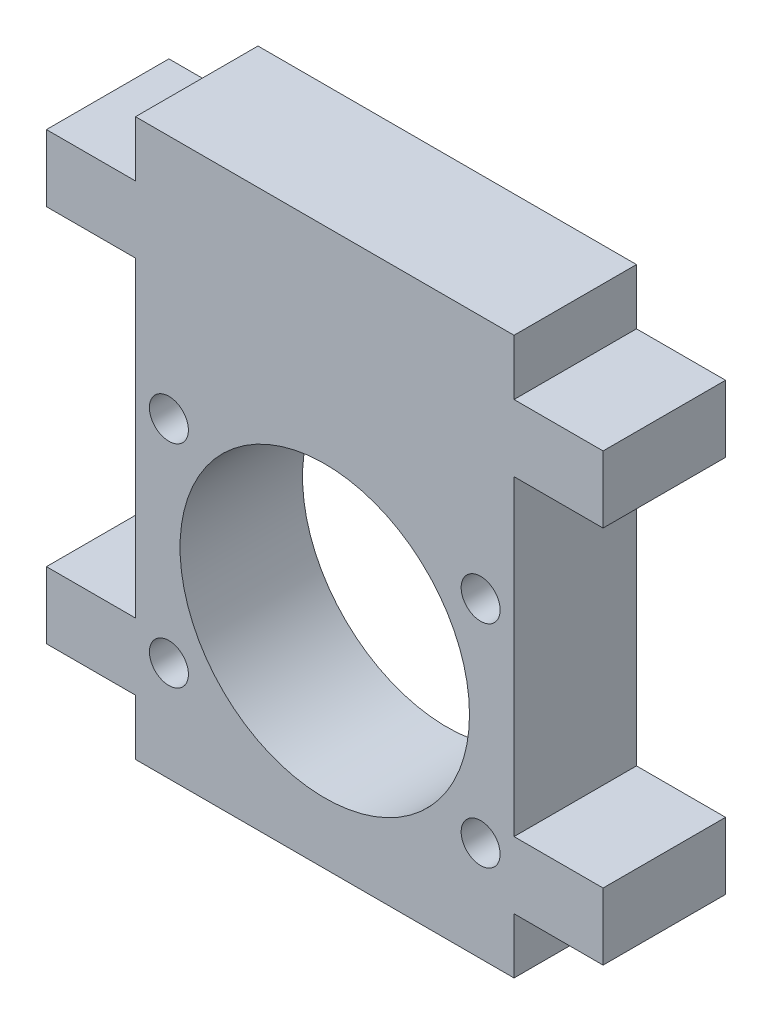
ISO-10303-21;
HEADER;
FILE_DESCRIPTION(('STEP AP214'),'2;1');
FILE_NAME('part.step','',(''),(''),'','','');
FILE_SCHEMA(('AUTOMOTIVE_DESIGN { 1 0 10303 214 1 1 1 1 }'));
ENDSEC;
DATA;
#1=APPLICATION_CONTEXT('core data for automotive mechanical design processes');
#2=APPLICATION_PROTOCOL_DEFINITION('international standard','automotive_design',2000,#1);
#3=PRODUCT_CONTEXT('',#1,'mechanical');
#4=PRODUCT('Part','Part','',(#3));
#5=PRODUCT_RELATED_PRODUCT_CATEGORY('part','',(#4));
#6=PRODUCT_DEFINITION_FORMATION('','',#4);
#7=PRODUCT_DEFINITION_CONTEXT('part definition',#1,'design');
#8=PRODUCT_DEFINITION('design','',#6,#7);
#9=PRODUCT_DEFINITION_SHAPE('','',#8);
#10=(LENGTH_UNIT() NAMED_UNIT(*) SI_UNIT(.MILLI.,.METRE.));
#11=(NAMED_UNIT(*) PLANE_ANGLE_UNIT() SI_UNIT($,.RADIAN.));
#12=(NAMED_UNIT(*) SI_UNIT($,.STERADIAN.) SOLID_ANGLE_UNIT());
#13=UNCERTAINTY_MEASURE_WITH_UNIT(LENGTH_MEASURE(1.E-05),#10,'distance_accuracy_value','');
#14=(GEOMETRIC_REPRESENTATION_CONTEXT(3) GLOBAL_UNCERTAINTY_ASSIGNED_CONTEXT((#13)) GLOBAL_UNIT_ASSIGNED_CONTEXT((#10,
#11,#12)) REPRESENTATION_CONTEXT('',''));
#15=CARTESIAN_POINT('',(0.,0.,0.));
#16=DIRECTION('',(0.,0.,1.));
#17=DIRECTION('',(1.,0.,0.));
#18=AXIS2_PLACEMENT_3D('',#15,#16,#17);
#19=CARTESIAN_POINT('',(0.,0.,11.));
#20=DIRECTION('',(0.,0.,1.));
#21=DIRECTION('',(1.,0.,0.));
#22=AXIS2_PLACEMENT_3D('',#19,#20,#21);
#23=PLANE('',#22);
#24=CARTESIAN_POINT('',(31.,4.,11.));
#25=DIRECTION('',(0.,0.,1.));
#26=DIRECTION('',(1.,0.,0.));
#27=AXIS2_PLACEMENT_3D('',#24,#25,#26);
#28=CIRCLE('',#27,1.75000000000001);
#29=CARTESIAN_POINT('',(32.75,4.,11.));
#30=VERTEX_POINT('',#29);
#31=EDGE_CURVE('E399',#30,#30,#28,.T.);
#32=ORIENTED_EDGE('',*,*,#31,.F.);
#33=EDGE_LOOP('',(#32));
#34=FACE_BOUND('',#33,.T.);
#35=CARTESIAN_POINT('',(2.99999999999999,23.,11.));
#36=DIRECTION('',(0.,0.,1.));
#37=DIRECTION('',(1.,0.,0.));
#38=AXIS2_PLACEMENT_3D('',#35,#36,#37);
#39=CIRCLE('',#38,1.75);
#40=CARTESIAN_POINT('',(4.74999999999999,23.,11.));
#41=VERTEX_POINT('',#40);
#42=EDGE_CURVE('E411',#41,#41,#39,.T.);
#43=ORIENTED_EDGE('',*,*,#42,.F.);
#44=EDGE_LOOP('',(#43));
#45=FACE_BOUND('',#44,.T.);
#46=DIRECTION('',(0.,-1.,0.));
#47=VECTOR('',#46,1.);
#48=CARTESIAN_POINT('',(0.,0.,11.));
#49=LINE('',#48,#47);
#50=CARTESIAN_POINT('',(0.,0.,11.));
#51=VERTEX_POINT('',#50);
#52=CARTESIAN_POINT('',(0.,-5.,11.));
#53=VERTEX_POINT('',#52);
#54=EDGE_CURVE('E242',#51,#53,#49,.T.);
#55=ORIENTED_EDGE('',*,*,#54,.T.);
#56=DIRECTION('',(1.,0.,0.));
#57=VECTOR('',#56,1.);
#58=CARTESIAN_POINT('',(0.,-5.,11.));
#59=LINE('',#58,#57);
#60=CARTESIAN_POINT('',(34.,-5.,11.));
#61=VERTEX_POINT('',#60);
#62=EDGE_CURVE('E128',#53,#61,#59,.T.);
#63=ORIENTED_EDGE('',*,*,#62,.T.);
#64=DIRECTION('',(0.,1.,0.));
#65=VECTOR('',#64,1.);
#66=CARTESIAN_POINT('',(34.,-5.,11.));
#67=LINE('',#66,#65);
#68=CARTESIAN_POINT('',(34.,0.,11.));
#69=VERTEX_POINT('',#68);
#70=EDGE_CURVE('E293',#61,#69,#67,.T.);
#71=ORIENTED_EDGE('',*,*,#70,.T.);
#72=DIRECTION('',(1.,0.,0.));
#73=VECTOR('',#72,1.);
#74=CARTESIAN_POINT('',(34.,0.,11.));
#75=LINE('',#74,#73);
#76=CARTESIAN_POINT('',(42.,0.,11.));
#77=VERTEX_POINT('',#76);
#78=EDGE_CURVE('E312',#69,#77,#75,.T.);
#79=ORIENTED_EDGE('',*,*,#78,.T.);
#80=DIRECTION('',(0.,1.,0.));
#81=VECTOR('',#80,1.);
#82=CARTESIAN_POINT('',(42.,0.,11.));
#83=LINE('',#82,#81);
#84=CARTESIAN_POINT('',(42.,6.,11.));
#85=VERTEX_POINT('',#84);
#86=EDGE_CURVE('E309',#77,#85,#83,.T.);
#87=ORIENTED_EDGE('',*,*,#86,.T.);
#88=DIRECTION('',(-1.,0.,0.));
#89=VECTOR('',#88,1.);
#90=CARTESIAN_POINT('',(42.,6.,11.));
#91=LINE('',#90,#89);
#92=CARTESIAN_POINT('',(34.,6.,11.));
#93=VERTEX_POINT('',#92);
#94=EDGE_CURVE('E311',#85,#93,#91,.T.);
#95=ORIENTED_EDGE('',*,*,#94,.T.);
#96=DIRECTION('',(0.,1.,0.));
#97=VECTOR('',#96,1.);
#98=CARTESIAN_POINT('',(34.,6.,11.));
#99=LINE('',#98,#97);
#100=CARTESIAN_POINT('',(34.,34.,11.));
#101=VERTEX_POINT('',#100);
#102=EDGE_CURVE('E314',#93,#101,#99,.T.);
#103=ORIENTED_EDGE('',*,*,#102,.T.);
#104=DIRECTION('',(1.,0.,0.));
#105=VECTOR('',#104,1.);
#106=CARTESIAN_POINT('',(34.,34.,11.));
#107=LINE('',#106,#105);
#108=CARTESIAN_POINT('',(42.,34.,11.));
#109=VERTEX_POINT('',#108);
#110=EDGE_CURVE('E320',#101,#109,#107,.T.);
#111=ORIENTED_EDGE('',*,*,#110,.T.);
#112=DIRECTION('',(0.,1.,0.));
#113=VECTOR('',#112,1.);
#114=CARTESIAN_POINT('',(42.,34.,11.));
#115=LINE('',#114,#113);
#116=CARTESIAN_POINT('',(42.,40.,11.));
#117=VERTEX_POINT('',#116);
#118=EDGE_CURVE('E322',#109,#117,#115,.T.);
#119=ORIENTED_EDGE('',*,*,#118,.T.);
#120=DIRECTION('',(-1.,0.,0.));
#121=VECTOR('',#120,1.);
#122=CARTESIAN_POINT('',(42.,40.,11.));
#123=LINE('',#122,#121);
#124=CARTESIAN_POINT('',(34.,40.,11.));
#125=VERTEX_POINT('',#124);
#126=EDGE_CURVE('E324',#117,#125,#123,.T.);
#127=ORIENTED_EDGE('',*,*,#126,.T.);
#128=DIRECTION('',(0.,1.,0.));
#129=VECTOR('',#128,1.);
#130=CARTESIAN_POINT('',(34.,40.,11.));
#131=LINE('',#130,#129);
#132=CARTESIAN_POINT('',(34.,45.,11.));
#133=VERTEX_POINT('',#132);
#134=EDGE_CURVE('E326',#125,#133,#131,.T.);
#135=ORIENTED_EDGE('',*,*,#134,.T.);
#136=DIRECTION('',(-1.,0.,0.));
#137=VECTOR('',#136,1.);
#138=CARTESIAN_POINT('',(34.,45.,11.));
#139=LINE('',#138,#137);
#140=CARTESIAN_POINT('',(0.,45.,11.));
#141=VERTEX_POINT('',#140);
#142=EDGE_CURVE('E328',#133,#141,#139,.T.);
#143=ORIENTED_EDGE('',*,*,#142,.T.);
#144=DIRECTION('',(0.,-1.,0.));
#145=VECTOR('',#144,1.);
#146=CARTESIAN_POINT('',(0.,45.,11.));
#147=LINE('',#146,#145);
#148=CARTESIAN_POINT('',(0.,40.,11.));
#149=VERTEX_POINT('',#148);
#150=EDGE_CURVE('E330',#141,#149,#147,.T.);
#151=ORIENTED_EDGE('',*,*,#150,.T.);
#152=DIRECTION('',(-1.,0.,0.));
#153=VECTOR('',#152,1.);
#154=CARTESIAN_POINT('',(0.,40.,11.));
#155=LINE('',#154,#153);
#156=CARTESIAN_POINT('',(-8.00000000000001,40.,11.));
#157=VERTEX_POINT('',#156);
#158=EDGE_CURVE('E332',#149,#157,#155,.T.);
#159=ORIENTED_EDGE('',*,*,#158,.T.);
#160=DIRECTION('',(0.,-1.,0.));
#161=VECTOR('',#160,1.);
#162=CARTESIAN_POINT('',(-8.00000000000001,40.,11.));
#163=LINE('',#162,#161);
#164=CARTESIAN_POINT('',(-8.00000000000001,34.,11.));
#165=VERTEX_POINT('',#164);
#166=EDGE_CURVE('E334',#157,#165,#163,.T.);
#167=ORIENTED_EDGE('',*,*,#166,.T.);
#168=DIRECTION('',(1.,0.,0.));
#169=VECTOR('',#168,1.);
#170=CARTESIAN_POINT('',(-8.00000000000001,34.,11.));
#171=LINE('',#170,#169);
#172=CARTESIAN_POINT('',(0.,34.,11.));
#173=VERTEX_POINT('',#172);
#174=EDGE_CURVE('E336',#165,#173,#171,.T.);
#175=ORIENTED_EDGE('',*,*,#174,.T.);
#176=DIRECTION('',(0.,-1.,0.));
#177=VECTOR('',#176,1.);
#178=CARTESIAN_POINT('',(0.,34.,11.));
#179=LINE('',#178,#177);
#180=CARTESIAN_POINT('',(0.,6.,11.));
#181=VERTEX_POINT('',#180);
#182=EDGE_CURVE('E183',#173,#181,#179,.T.);
#183=ORIENTED_EDGE('',*,*,#182,.T.);
#184=DIRECTION('',(-1.,0.,0.));
#185=VECTOR('',#184,1.);
#186=CARTESIAN_POINT('',(0.,6.,11.));
#187=LINE('',#186,#185);
#188=CARTESIAN_POINT('',(-8.,6.,11.));
#189=VERTEX_POINT('',#188);
#190=EDGE_CURVE('E177',#181,#189,#187,.T.);
#191=ORIENTED_EDGE('',*,*,#190,.T.);
#192=DIRECTION('',(0.,-1.,0.));
#193=VECTOR('',#192,1.);
#194=CARTESIAN_POINT('',(-8.,6.,11.));
#195=LINE('',#194,#193);
#196=CARTESIAN_POINT('',(-8.,0.,11.));
#197=VERTEX_POINT('',#196);
#198=EDGE_CURVE('E181',#189,#197,#195,.T.);
#199=ORIENTED_EDGE('',*,*,#198,.T.);
#200=DIRECTION('',(1.,0.,0.));
#201=VECTOR('',#200,1.);
#202=CARTESIAN_POINT('',(-8.,0.,11.));
#203=LINE('',#202,#201);
#204=EDGE_CURVE('E49',#197,#51,#203,.T.);
#205=ORIENTED_EDGE('',*,*,#204,.T.);
#206=EDGE_LOOP('',(#55,#63,#71,#79,#87,#95,#103,#111,#119,#127,#135,#143,#151,#159,#167,#175,
#183,#191,#199,#205));
#207=FACE_BOUND('',#206,.T.);
#208=CARTESIAN_POINT('',(17.,13.5,11.));
#209=DIRECTION('',(0.,0.,1.));
#210=DIRECTION('',(1.,0.,0.));
#211=AXIS2_PLACEMENT_3D('',#208,#209,#210);
#212=CIRCLE('',#211,13.);
#213=CARTESIAN_POINT('',(30.,13.5,11.));
#214=VERTEX_POINT('',#213);
#215=EDGE_CURVE('E205',#214,#214,#212,.T.);
#216=ORIENTED_EDGE('',*,*,#215,.F.);
#217=EDGE_LOOP('',(#216));
#218=FACE_BOUND('',#217,.T.);
#219=CARTESIAN_POINT('',(31.,23.,11.));
#220=DIRECTION('',(0.,0.,1.));
#221=DIRECTION('',(1.,0.,0.));
#222=AXIS2_PLACEMENT_3D('',#219,#220,#221);
#223=CIRCLE('',#222,1.75);
#224=CARTESIAN_POINT('',(32.75,23.,11.));
#225=VERTEX_POINT('',#224);
#226=EDGE_CURVE('E405',#225,#225,#223,.T.);
#227=ORIENTED_EDGE('',*,*,#226,.F.);
#228=EDGE_LOOP('',(#227));
#229=FACE_BOUND('',#228,.T.);
#230=CARTESIAN_POINT('',(2.99999999999999,3.99999999999999,11.));
#231=DIRECTION('',(0.,0.,1.));
#232=DIRECTION('',(1.,0.,0.));
#233=AXIS2_PLACEMENT_3D('',#230,#231,#232);
#234=CIRCLE('',#233,1.75);
#235=CARTESIAN_POINT('',(4.74999999999999,3.99999999999999,11.));
#236=VERTEX_POINT('',#235);
#237=EDGE_CURVE('E390',#236,#236,#234,.T.);
#238=ORIENTED_EDGE('',*,*,#237,.F.);
#239=EDGE_LOOP('',(#238));
#240=FACE_BOUND('',#239,.T.);
#241=ADVANCED_FACE('F32',(#34,#45,#207,#218,#229,#240),#23,.T.);
#242=CARTESIAN_POINT('',(0.,0.,0.));
#243=DIRECTION('',(0.,0.,1.));
#244=DIRECTION('',(1.,0.,0.));
#245=AXIS2_PLACEMENT_3D('',#242,#243,#244);
#246=PLANE('',#245);
#247=DIRECTION('',(0.,-1.,0.));
#248=VECTOR('',#247,1.);
#249=CARTESIAN_POINT('',(0.,0.,0.));
#250=LINE('',#249,#248);
#251=CARTESIAN_POINT('',(0.,0.,0.));
#252=VERTEX_POINT('',#251);
#253=CARTESIAN_POINT('',(0.,-5.,0.));
#254=VERTEX_POINT('',#253);
#255=EDGE_CURVE('E201',#252,#254,#250,.T.);
#256=ORIENTED_EDGE('',*,*,#255,.F.);
#257=DIRECTION('',(1.,0.,0.));
#258=VECTOR('',#257,1.);
#259=CARTESIAN_POINT('',(-8.,0.,0.));
#260=LINE('',#259,#258);
#261=CARTESIAN_POINT('',(-8.,0.,0.));
#262=VERTEX_POINT('',#261);
#263=EDGE_CURVE('E120',#262,#252,#260,.T.);
#264=ORIENTED_EDGE('',*,*,#263,.F.);
#265=DIRECTION('',(0.,-1.,0.));
#266=VECTOR('',#265,1.);
#267=CARTESIAN_POINT('',(-8.,6.,0.));
#268=LINE('',#267,#266);
#269=CARTESIAN_POINT('',(-8.,6.,0.));
#270=VERTEX_POINT('',#269);
#271=EDGE_CURVE('E114',#270,#262,#268,.T.);
#272=ORIENTED_EDGE('',*,*,#271,.F.);
#273=DIRECTION('',(-1.,0.,0.));
#274=VECTOR('',#273,1.);
#275=CARTESIAN_POINT('',(0.,6.,0.));
#276=LINE('',#275,#274);
#277=CARTESIAN_POINT('',(0.,6.,0.));
#278=VERTEX_POINT('',#277);
#279=EDGE_CURVE('E191',#278,#270,#276,.T.);
#280=ORIENTED_EDGE('',*,*,#279,.F.);
#281=DIRECTION('',(0.,-1.,0.));
#282=VECTOR('',#281,1.);
#283=CARTESIAN_POINT('',(0.,25.,0.));
#284=LINE('',#283,#282);
#285=CARTESIAN_POINT('',(0.,34.,0.));
#286=VERTEX_POINT('',#285);
#287=EDGE_CURVE('E237',#286,#278,#284,.T.);
#288=ORIENTED_EDGE('',*,*,#287,.F.);
#289=DIRECTION('',(1.,0.,0.));
#290=VECTOR('',#289,1.);
#291=CARTESIAN_POINT('',(-8.00000000000001,34.,0.));
#292=LINE('',#291,#290);
#293=CARTESIAN_POINT('',(-8.00000000000001,34.,0.));
#294=VERTEX_POINT('',#293);
#295=EDGE_CURVE('E234',#294,#286,#292,.T.);
#296=ORIENTED_EDGE('',*,*,#295,.F.);
#297=DIRECTION('',(0.,-1.,0.));
#298=VECTOR('',#297,1.);
#299=CARTESIAN_POINT('',(-8.00000000000001,40.,0.));
#300=LINE('',#299,#298);
#301=CARTESIAN_POINT('',(-8.00000000000001,40.,0.));
#302=VERTEX_POINT('',#301);
#303=EDGE_CURVE('E232',#302,#294,#300,.T.);
#304=ORIENTED_EDGE('',*,*,#303,.F.);
#305=DIRECTION('',(-1.,0.,0.));
#306=VECTOR('',#305,1.);
#307=CARTESIAN_POINT('',(0.,40.,0.));
#308=LINE('',#307,#306);
#309=CARTESIAN_POINT('',(0.,40.,0.));
#310=VERTEX_POINT('',#309);
#311=EDGE_CURVE('E230',#310,#302,#308,.T.);
#312=ORIENTED_EDGE('',*,*,#311,.F.);
#313=DIRECTION('',(0.,-1.,0.));
#314=VECTOR('',#313,1.);
#315=CARTESIAN_POINT('',(0.,45.,0.));
#316=LINE('',#315,#314);
#317=CARTESIAN_POINT('',(0.,45.,0.));
#318=VERTEX_POINT('',#317);
#319=EDGE_CURVE('E228',#318,#310,#316,.T.);
#320=ORIENTED_EDGE('',*,*,#319,.F.);
#321=DIRECTION('',(-1.,0.,0.));
#322=VECTOR('',#321,1.);
#323=CARTESIAN_POINT('',(34.,45.,0.));
#324=LINE('',#323,#322);
#325=CARTESIAN_POINT('',(34.,45.,0.));
#326=VERTEX_POINT('',#325);
#327=EDGE_CURVE('E226',#326,#318,#324,.T.);
#328=ORIENTED_EDGE('',*,*,#327,.F.);
#329=DIRECTION('',(0.,1.,0.));
#330=VECTOR('',#329,1.);
#331=CARTESIAN_POINT('',(34.,40.,0.));
#332=LINE('',#331,#330);
#333=CARTESIAN_POINT('',(34.,40.,0.));
#334=VERTEX_POINT('',#333);
#335=EDGE_CURVE('E224',#334,#326,#332,.T.);
#336=ORIENTED_EDGE('',*,*,#335,.F.);
#337=DIRECTION('',(-1.,0.,0.));
#338=VECTOR('',#337,1.);
#339=CARTESIAN_POINT('',(42.,40.,0.));
#340=LINE('',#339,#338);
#341=CARTESIAN_POINT('',(42.,40.,0.));
#342=VERTEX_POINT('',#341);
#343=EDGE_CURVE('E222',#342,#334,#340,.T.);
#344=ORIENTED_EDGE('',*,*,#343,.F.);
#345=DIRECTION('',(0.,1.,0.));
#346=VECTOR('',#345,1.);
#347=CARTESIAN_POINT('',(42.,34.,0.));
#348=LINE('',#347,#346);
#349=CARTESIAN_POINT('',(42.,34.,0.));
#350=VERTEX_POINT('',#349);
#351=EDGE_CURVE('E220',#350,#342,#348,.T.);
#352=ORIENTED_EDGE('',*,*,#351,.F.);
#353=DIRECTION('',(1.,0.,0.));
#354=VECTOR('',#353,1.);
#355=CARTESIAN_POINT('',(34.,34.,0.));
#356=LINE('',#355,#354);
#357=CARTESIAN_POINT('',(34.,34.,0.));
#358=VERTEX_POINT('',#357);
#359=EDGE_CURVE('E218',#358,#350,#356,.T.);
#360=ORIENTED_EDGE('',*,*,#359,.F.);
#361=DIRECTION('',(0.,1.,0.));
#362=VECTOR('',#361,1.);
#363=CARTESIAN_POINT('',(34.,25.,0.));
#364=LINE('',#363,#362);
#365=CARTESIAN_POINT('',(34.,6.,0.));
#366=VERTEX_POINT('',#365);
#367=EDGE_CURVE('E216',#366,#358,#364,.T.);
#368=ORIENTED_EDGE('',*,*,#367,.F.);
#369=DIRECTION('',(-1.,0.,0.));
#370=VECTOR('',#369,1.);
#371=CARTESIAN_POINT('',(42.,6.,0.));
#372=LINE('',#371,#370);
#373=CARTESIAN_POINT('',(42.,6.,0.));
#374=VERTEX_POINT('',#373);
#375=EDGE_CURVE('E213',#374,#366,#372,.T.);
#376=ORIENTED_EDGE('',*,*,#375,.F.);
#377=DIRECTION('',(0.,1.,0.));
#378=VECTOR('',#377,1.);
#379=CARTESIAN_POINT('',(42.,0.,0.));
#380=LINE('',#379,#378);
#381=CARTESIAN_POINT('',(42.,0.,0.));
#382=VERTEX_POINT('',#381);
#383=EDGE_CURVE('E211',#382,#374,#380,.T.);
#384=ORIENTED_EDGE('',*,*,#383,.F.);
#385=DIRECTION('',(1.,0.,0.));
#386=VECTOR('',#385,1.);
#387=CARTESIAN_POINT('',(34.,0.,0.));
#388=LINE('',#387,#386);
#389=CARTESIAN_POINT('',(34.,0.,0.));
#390=VERTEX_POINT('',#389);
#391=EDGE_CURVE('E209',#390,#382,#388,.T.);
#392=ORIENTED_EDGE('',*,*,#391,.F.);
#393=DIRECTION('',(0.,1.,0.));
#394=VECTOR('',#393,1.);
#395=CARTESIAN_POINT('',(34.,-5.,0.));
#396=LINE('',#395,#394);
#397=CARTESIAN_POINT('',(34.,-5.,0.));
#398=VERTEX_POINT('',#397);
#399=EDGE_CURVE('E207',#398,#390,#396,.T.);
#400=ORIENTED_EDGE('',*,*,#399,.F.);
#401=DIRECTION('',(1.,0.,0.));
#402=VECTOR('',#401,1.);
#403=CARTESIAN_POINT('',(0.,-5.,0.));
#404=LINE('',#403,#402);
#405=EDGE_CURVE('E204',#254,#398,#404,.T.);
#406=ORIENTED_EDGE('',*,*,#405,.F.);
#407=EDGE_LOOP('',(#256,#264,#272,#280,#288,#296,#304,#312,#320,#328,#336,#344,#352,#360,#368,
#376,#384,#392,#400,#406));
#408=FACE_BOUND('',#407,.T.);
#409=CARTESIAN_POINT('',(17.,13.5,0.));
#410=DIRECTION('',(0.,0.,1.));
#411=DIRECTION('',(1.,0.,0.));
#412=AXIS2_PLACEMENT_3D('',#409,#410,#411);
#413=CIRCLE('',#412,13.);
#414=CARTESIAN_POINT('',(30.,13.5,0.));
#415=VERTEX_POINT('',#414);
#416=EDGE_CURVE('E414',#415,#415,#413,.T.);
#417=ORIENTED_EDGE('',*,*,#416,.T.);
#418=EDGE_LOOP('',(#417));
#419=FACE_BOUND('',#418,.T.);
#420=CARTESIAN_POINT('',(2.99999999999999,23.,0.));
#421=DIRECTION('',(0.,0.,1.));
#422=DIRECTION('',(1.,0.,0.));
#423=AXIS2_PLACEMENT_3D('',#420,#421,#422);
#424=CIRCLE('',#423,1.75);
#425=CARTESIAN_POINT('',(4.74999999999999,23.,0.));
#426=VERTEX_POINT('',#425);
#427=EDGE_CURVE('E408',#426,#426,#424,.T.);
#428=ORIENTED_EDGE('',*,*,#427,.T.);
#429=EDGE_LOOP('',(#428));
#430=FACE_BOUND('',#429,.T.);
#431=CARTESIAN_POINT('',(31.,23.,0.));
#432=DIRECTION('',(0.,0.,1.));
#433=DIRECTION('',(1.,0.,0.));
#434=AXIS2_PLACEMENT_3D('',#431,#432,#433);
#435=CIRCLE('',#434,1.75);
#436=CARTESIAN_POINT('',(32.75,23.,0.));
#437=VERTEX_POINT('',#436);
#438=EDGE_CURVE('E402',#437,#437,#435,.T.);
#439=ORIENTED_EDGE('',*,*,#438,.T.);
#440=EDGE_LOOP('',(#439));
#441=FACE_BOUND('',#440,.T.);
#442=CARTESIAN_POINT('',(31.,4.,0.));
#443=DIRECTION('',(0.,0.,1.));
#444=DIRECTION('',(1.,0.,0.));
#445=AXIS2_PLACEMENT_3D('',#442,#443,#444);
#446=CIRCLE('',#445,1.75000000000001);
#447=CARTESIAN_POINT('',(32.75,4.,0.));
#448=VERTEX_POINT('',#447);
#449=EDGE_CURVE('E396',#448,#448,#446,.T.);
#450=ORIENTED_EDGE('',*,*,#449,.T.);
#451=EDGE_LOOP('',(#450));
#452=FACE_BOUND('',#451,.T.);
#453=CARTESIAN_POINT('',(2.99999999999999,3.99999999999999,0.));
#454=DIRECTION('',(0.,0.,1.));
#455=DIRECTION('',(1.,0.,0.));
#456=AXIS2_PLACEMENT_3D('',#453,#454,#455);
#457=CIRCLE('',#456,1.75);
#458=CARTESIAN_POINT('',(4.74999999999999,3.99999999999999,0.));
#459=VERTEX_POINT('',#458);
#460=EDGE_CURVE('E393',#459,#459,#457,.T.);
#461=ORIENTED_EDGE('',*,*,#460,.T.);
#462=EDGE_LOOP('',(#461));
#463=FACE_BOUND('',#462,.T.);
#464=ADVANCED_FACE('F297',(#408,#419,#430,#441,#452,#463),#246,.F.);
#465=CARTESIAN_POINT('',(0.,0.,11.));
#466=DIRECTION('',(1.,0.,0.));
#467=DIRECTION('',(0.,1.,0.));
#468=AXIS2_PLACEMENT_3D('',#465,#466,#467);
#469=PLANE('',#468);
#470=ORIENTED_EDGE('',*,*,#255,.T.);
#471=DIRECTION('',(0.,0.,-1.));
#472=VECTOR('',#471,1.);
#473=CARTESIAN_POINT('',(0.,-5.,11.));
#474=LINE('',#473,#472);
#475=EDGE_CURVE('E11',#53,#254,#474,.T.);
#476=ORIENTED_EDGE('',*,*,#475,.F.);
#477=ORIENTED_EDGE('',*,*,#54,.F.);
#478=DIRECTION('',(0.,0.,-1.));
#479=VECTOR('',#478,1.);
#480=CARTESIAN_POINT('',(0.,0.,11.));
#481=LINE('',#480,#479);
#482=EDGE_CURVE('E197',#51,#252,#481,.T.);
#483=ORIENTED_EDGE('',*,*,#482,.T.);
#484=EDGE_LOOP('',(#470,#476,#477,#483));
#485=FACE_BOUND('',#484,.T.);
#486=ADVANCED_FACE('F34',(#485),#469,.F.);
#487=CARTESIAN_POINT('',(0.,-5.,11.));
#488=DIRECTION('',(0.,1.,0.));
#489=DIRECTION('',(-1.,0.,0.));
#490=AXIS2_PLACEMENT_3D('',#487,#488,#489);
#491=PLANE('',#490);
#492=ORIENTED_EDGE('',*,*,#405,.T.);
#493=DIRECTION('',(0.,0.,-1.));
#494=VECTOR('',#493,1.);
#495=CARTESIAN_POINT('',(34.,-5.,11.));
#496=LINE('',#495,#494);
#497=EDGE_CURVE('E41',#61,#398,#496,.T.);
#498=ORIENTED_EDGE('',*,*,#497,.F.);
#499=ORIENTED_EDGE('',*,*,#62,.F.);
#500=ORIENTED_EDGE('',*,*,#475,.T.);
#501=EDGE_LOOP('',(#492,#498,#499,#500));
#502=FACE_BOUND('',#501,.T.);
#503=ADVANCED_FACE('F615',(#502),#491,.F.);
#504=CARTESIAN_POINT('',(34.,-5.,11.));
#505=DIRECTION('',(-1.,0.,0.));
#506=DIRECTION('',(0.,-1.,0.));
#507=AXIS2_PLACEMENT_3D('',#504,#505,#506);
#508=PLANE('',#507);
#509=ORIENTED_EDGE('',*,*,#399,.T.);
#510=DIRECTION('',(0.,0.,-1.));
#511=VECTOR('',#510,1.);
#512=CARTESIAN_POINT('',(34.,0.,11.));
#513=LINE('',#512,#511);
#514=EDGE_CURVE('E285',#69,#390,#513,.T.);
#515=ORIENTED_EDGE('',*,*,#514,.F.);
#516=ORIENTED_EDGE('',*,*,#70,.F.);
#517=ORIENTED_EDGE('',*,*,#497,.T.);
#518=EDGE_LOOP('',(#509,#515,#516,#517));
#519=FACE_BOUND('',#518,.T.);
#520=ADVANCED_FACE('F291',(#519),#508,.F.);
#521=CARTESIAN_POINT('',(34.,0.,11.));
#522=DIRECTION('',(0.,1.,0.));
#523=DIRECTION('',(-1.,0.,0.));
#524=AXIS2_PLACEMENT_3D('',#521,#522,#523);
#525=PLANE('',#524);
#526=ORIENTED_EDGE('',*,*,#391,.T.);
#527=DIRECTION('',(0.,0.,-1.));
#528=VECTOR('',#527,1.);
#529=CARTESIAN_POINT('',(42.,0.,11.));
#530=LINE('',#529,#528);
#531=EDGE_CURVE('E282',#77,#382,#530,.T.);
#532=ORIENTED_EDGE('',*,*,#531,.F.);
#533=ORIENTED_EDGE('',*,*,#78,.F.);
#534=ORIENTED_EDGE('',*,*,#514,.T.);
#535=EDGE_LOOP('',(#526,#532,#533,#534));
#536=FACE_BOUND('',#535,.T.);
#537=ADVANCED_FACE('F303',(#536),#525,.F.);
#538=CARTESIAN_POINT('',(42.,0.,11.));
#539=DIRECTION('',(-1.,0.,0.));
#540=DIRECTION('',(0.,0.,1.));
#541=AXIS2_PLACEMENT_3D('',#538,#539,#540);
#542=PLANE('',#541);
#543=ORIENTED_EDGE('',*,*,#383,.T.);
#544=DIRECTION('',(0.,0.,-1.));
#545=VECTOR('',#544,1.);
#546=CARTESIAN_POINT('',(42.,6.,11.));
#547=LINE('',#546,#545);
#548=EDGE_CURVE('E279',#85,#374,#547,.T.);
#549=ORIENTED_EDGE('',*,*,#548,.F.);
#550=ORIENTED_EDGE('',*,*,#86,.F.);
#551=ORIENTED_EDGE('',*,*,#531,.T.);
#552=EDGE_LOOP('',(#543,#549,#550,#551));
#553=FACE_BOUND('',#552,.T.);
#554=ADVANCED_FACE('F307',(#553),#542,.F.);
#555=CARTESIAN_POINT('',(42.,6.,11.));
#556=DIRECTION('',(0.,-1.,0.));
#557=DIRECTION('',(1.,0.,0.));
#558=AXIS2_PLACEMENT_3D('',#555,#556,#557);
#559=PLANE('',#558);
#560=ORIENTED_EDGE('',*,*,#375,.T.);
#561=DIRECTION('',(0.,0.,-1.));
#562=VECTOR('',#561,1.);
#563=CARTESIAN_POINT('',(34.,6.,11.));
#564=LINE('',#563,#562);
#565=EDGE_CURVE('E276',#93,#366,#564,.T.);
#566=ORIENTED_EDGE('',*,*,#565,.F.);
#567=ORIENTED_EDGE('',*,*,#94,.F.);
#568=ORIENTED_EDGE('',*,*,#548,.T.);
#569=EDGE_LOOP('',(#560,#566,#567,#568));
#570=FACE_BOUND('',#569,.T.);
#571=ADVANCED_FACE('F579',(#570),#559,.F.);
#572=CARTESIAN_POINT('',(34.,25.,11.));
#573=DIRECTION('',(-1.,0.,0.));
#574=DIRECTION('',(0.,-1.,0.));
#575=AXIS2_PLACEMENT_3D('',#572,#573,#574);
#576=PLANE('',#575);
#577=ORIENTED_EDGE('',*,*,#367,.T.);
#578=DIRECTION('',(0.,0.,-1.));
#579=VECTOR('',#578,1.);
#580=CARTESIAN_POINT('',(34.,34.,11.));
#581=LINE('',#580,#579);
#582=EDGE_CURVE('E273',#101,#358,#581,.T.);
#583=ORIENTED_EDGE('',*,*,#582,.F.);
#584=ORIENTED_EDGE('',*,*,#102,.F.);
#585=ORIENTED_EDGE('',*,*,#565,.T.);
#586=EDGE_LOOP('',(#577,#583,#584,#585));
#587=FACE_BOUND('',#586,.T.);
#588=ADVANCED_FACE('F569',(#587),#576,.F.);
#589=CARTESIAN_POINT('',(34.,34.,11.));
#590=DIRECTION('',(0.,1.,0.));
#591=DIRECTION('',(0.,0.,1.));
#592=AXIS2_PLACEMENT_3D('',#589,#590,#591);
#593=PLANE('',#592);
#594=ORIENTED_EDGE('',*,*,#359,.T.);
#595=DIRECTION('',(0.,0.,-1.));
#596=VECTOR('',#595,1.);
#597=CARTESIAN_POINT('',(42.,34.,11.));
#598=LINE('',#597,#596);
#599=EDGE_CURVE('E270',#109,#350,#598,.T.);
#600=ORIENTED_EDGE('',*,*,#599,.F.);
#601=ORIENTED_EDGE('',*,*,#110,.F.);
#602=ORIENTED_EDGE('',*,*,#582,.T.);
#603=EDGE_LOOP('',(#594,#600,#601,#602));
#604=FACE_BOUND('',#603,.T.);
#605=ADVANCED_FACE('F559',(#604),#593,.F.);
#606=CARTESIAN_POINT('',(42.,34.,11.));
#607=DIRECTION('',(-1.,0.,0.));
#608=DIRECTION('',(0.,0.,1.));
#609=AXIS2_PLACEMENT_3D('',#606,#607,#608);
#610=PLANE('',#609);
#611=ORIENTED_EDGE('',*,*,#351,.T.);
#612=DIRECTION('',(0.,0.,-1.));
#613=VECTOR('',#612,1.);
#614=CARTESIAN_POINT('',(42.,40.,11.));
#615=LINE('',#614,#613);
#616=EDGE_CURVE('E267',#117,#342,#615,.T.);
#617=ORIENTED_EDGE('',*,*,#616,.F.);
#618=ORIENTED_EDGE('',*,*,#118,.F.);
#619=ORIENTED_EDGE('',*,*,#599,.T.);
#620=EDGE_LOOP('',(#611,#617,#618,#619));
#621=FACE_BOUND('',#620,.T.);
#622=ADVANCED_FACE('F549',(#621),#610,.F.);
#623=CARTESIAN_POINT('',(42.,40.,11.));
#624=DIRECTION('',(0.,-1.,0.));
#625=DIRECTION('',(0.,0.,-1.));
#626=AXIS2_PLACEMENT_3D('',#623,#624,#625);
#627=PLANE('',#626);
#628=ORIENTED_EDGE('',*,*,#343,.T.);
#629=DIRECTION('',(0.,0.,-1.));
#630=VECTOR('',#629,1.);
#631=CARTESIAN_POINT('',(34.,40.,11.));
#632=LINE('',#631,#630);
#633=EDGE_CURVE('E264',#125,#334,#632,.T.);
#634=ORIENTED_EDGE('',*,*,#633,.F.);
#635=ORIENTED_EDGE('',*,*,#126,.F.);
#636=ORIENTED_EDGE('',*,*,#616,.T.);
#637=EDGE_LOOP('',(#628,#634,#635,#636));
#638=FACE_BOUND('',#637,.T.);
#639=ADVANCED_FACE('F539',(#638),#627,.F.);
#640=CARTESIAN_POINT('',(34.,40.,11.));
#641=DIRECTION('',(-1.,0.,0.));
#642=DIRECTION('',(0.,-1.,0.));
#643=AXIS2_PLACEMENT_3D('',#640,#641,#642);
#644=PLANE('',#643);
#645=ORIENTED_EDGE('',*,*,#335,.T.);
#646=DIRECTION('',(0.,0.,-1.));
#647=VECTOR('',#646,1.);
#648=CARTESIAN_POINT('',(34.,45.,11.));
#649=LINE('',#648,#647);
#650=EDGE_CURVE('E261',#133,#326,#649,.T.);
#651=ORIENTED_EDGE('',*,*,#650,.F.);
#652=ORIENTED_EDGE('',*,*,#134,.F.);
#653=ORIENTED_EDGE('',*,*,#633,.T.);
#654=EDGE_LOOP('',(#645,#651,#652,#653));
#655=FACE_BOUND('',#654,.T.);
#656=ADVANCED_FACE('F529',(#655),#644,.F.);
#657=CARTESIAN_POINT('',(34.,45.,11.));
#658=DIRECTION('',(0.,-1.,0.));
#659=DIRECTION('',(1.,0.,0.));
#660=AXIS2_PLACEMENT_3D('',#657,#658,#659);
#661=PLANE('',#660);
#662=ORIENTED_EDGE('',*,*,#327,.T.);
#663=DIRECTION('',(0.,0.,-1.));
#664=VECTOR('',#663,1.);
#665=CARTESIAN_POINT('',(0.,45.,11.));
#666=LINE('',#665,#664);
#667=EDGE_CURVE('E258',#141,#318,#666,.T.);
#668=ORIENTED_EDGE('',*,*,#667,.F.);
#669=ORIENTED_EDGE('',*,*,#142,.F.);
#670=ORIENTED_EDGE('',*,*,#650,.T.);
#671=EDGE_LOOP('',(#662,#668,#669,#670));
#672=FACE_BOUND('',#671,.T.);
#673=ADVANCED_FACE('F519',(#672),#661,.F.);
#674=CARTESIAN_POINT('',(0.,45.,11.));
#675=DIRECTION('',(1.,0.,0.));
#676=DIRECTION('',(0.,1.,0.));
#677=AXIS2_PLACEMENT_3D('',#674,#675,#676);
#678=PLANE('',#677);
#679=ORIENTED_EDGE('',*,*,#319,.T.);
#680=DIRECTION('',(0.,0.,-1.));
#681=VECTOR('',#680,1.);
#682=CARTESIAN_POINT('',(0.,40.,11.));
#683=LINE('',#682,#681);
#684=EDGE_CURVE('E255',#149,#310,#683,.T.);
#685=ORIENTED_EDGE('',*,*,#684,.F.);
#686=ORIENTED_EDGE('',*,*,#150,.F.);
#687=ORIENTED_EDGE('',*,*,#667,.T.);
#688=EDGE_LOOP('',(#679,#685,#686,#687));
#689=FACE_BOUND('',#688,.T.);
#690=ADVANCED_FACE('F509',(#689),#678,.F.);
#691=CARTESIAN_POINT('',(0.,40.,11.));
#692=DIRECTION('',(0.,-1.,0.));
#693=DIRECTION('',(0.,0.,-1.));
#694=AXIS2_PLACEMENT_3D('',#691,#692,#693);
#695=PLANE('',#694);
#696=ORIENTED_EDGE('',*,*,#311,.T.);
#697=DIRECTION('',(0.,0.,-1.));
#698=VECTOR('',#697,1.);
#699=CARTESIAN_POINT('',(-8.00000000000001,40.,11.));
#700=LINE('',#699,#698);
#701=EDGE_CURVE('E252',#157,#302,#700,.T.);
#702=ORIENTED_EDGE('',*,*,#701,.F.);
#703=ORIENTED_EDGE('',*,*,#158,.F.);
#704=ORIENTED_EDGE('',*,*,#684,.T.);
#705=EDGE_LOOP('',(#696,#702,#703,#704));
#706=FACE_BOUND('',#705,.T.);
#707=ADVANCED_FACE('F499',(#706),#695,.F.);
#708=CARTESIAN_POINT('',(-8.00000000000001,40.,11.));
#709=DIRECTION('',(1.,0.,0.));
#710=DIRECTION('',(0.,0.,-1.));
#711=AXIS2_PLACEMENT_3D('',#708,#709,#710);
#712=PLANE('',#711);
#713=ORIENTED_EDGE('',*,*,#303,.T.);
#714=DIRECTION('',(0.,0.,-1.));
#715=VECTOR('',#714,1.);
#716=CARTESIAN_POINT('',(-8.00000000000001,34.,11.));
#717=LINE('',#716,#715);
#718=EDGE_CURVE('E249',#165,#294,#717,.T.);
#719=ORIENTED_EDGE('',*,*,#718,.F.);
#720=ORIENTED_EDGE('',*,*,#166,.F.);
#721=ORIENTED_EDGE('',*,*,#701,.T.);
#722=EDGE_LOOP('',(#713,#719,#720,#721));
#723=FACE_BOUND('',#722,.T.);
#724=ADVANCED_FACE('F490',(#723),#712,.F.);
#725=CARTESIAN_POINT('',(-8.00000000000001,34.,11.));
#726=DIRECTION('',(0.,1.,0.));
#727=DIRECTION('',(0.,0.,1.));
#728=AXIS2_PLACEMENT_3D('',#725,#726,#727);
#729=PLANE('',#728);
#730=ORIENTED_EDGE('',*,*,#295,.T.);
#731=DIRECTION('',(0.,0.,-1.));
#732=VECTOR('',#731,1.);
#733=CARTESIAN_POINT('',(0.,34.,11.));
#734=LINE('',#733,#732);
#735=EDGE_CURVE('E246',#173,#286,#734,.T.);
#736=ORIENTED_EDGE('',*,*,#735,.F.);
#737=ORIENTED_EDGE('',*,*,#174,.F.);
#738=ORIENTED_EDGE('',*,*,#718,.T.);
#739=EDGE_LOOP('',(#730,#736,#737,#738));
#740=FACE_BOUND('',#739,.T.);
#741=ADVANCED_FACE('F342',(#740),#729,.F.);
#742=CARTESIAN_POINT('',(0.,25.,11.));
#743=DIRECTION('',(1.,0.,0.));
#744=DIRECTION('',(0.,1.,0.));
#745=AXIS2_PLACEMENT_3D('',#742,#743,#744);
#746=PLANE('',#745);
#747=ORIENTED_EDGE('',*,*,#287,.T.);
#748=DIRECTION('',(0.,0.,-1.));
#749=VECTOR('',#748,1.);
#750=CARTESIAN_POINT('',(0.,6.,11.));
#751=LINE('',#750,#749);
#752=EDGE_CURVE('E192',#181,#278,#751,.T.);
#753=ORIENTED_EDGE('',*,*,#752,.F.);
#754=ORIENTED_EDGE('',*,*,#182,.F.);
#755=ORIENTED_EDGE('',*,*,#735,.T.);
#756=EDGE_LOOP('',(#747,#753,#754,#755));
#757=FACE_BOUND('',#756,.T.);
#758=ADVANCED_FACE('F345',(#757),#746,.F.);
#759=CARTESIAN_POINT('',(0.,6.,11.));
#760=DIRECTION('',(0.,-1.,0.));
#761=DIRECTION('',(1.,0.,0.));
#762=AXIS2_PLACEMENT_3D('',#759,#760,#761);
#763=PLANE('',#762);
#764=ORIENTED_EDGE('',*,*,#279,.T.);
#765=DIRECTION('',(0.,0.,-1.));
#766=VECTOR('',#765,1.);
#767=CARTESIAN_POINT('',(-8.,6.,11.));
#768=LINE('',#767,#766);
#769=EDGE_CURVE('E188',#189,#270,#768,.T.);
#770=ORIENTED_EDGE('',*,*,#769,.F.);
#771=ORIENTED_EDGE('',*,*,#190,.F.);
#772=ORIENTED_EDGE('',*,*,#752,.T.);
#773=EDGE_LOOP('',(#764,#770,#771,#772));
#774=FACE_BOUND('',#773,.T.);
#775=ADVANCED_FACE('F189',(#774),#763,.F.);
#776=CARTESIAN_POINT('',(-8.,6.,11.));
#777=DIRECTION('',(1.,0.,0.));
#778=DIRECTION('',(0.,0.,-1.));
#779=AXIS2_PLACEMENT_3D('',#776,#777,#778);
#780=PLANE('',#779);
#781=ORIENTED_EDGE('',*,*,#271,.T.);
#782=DIRECTION('',(0.,0.,-1.));
#783=VECTOR('',#782,1.);
#784=CARTESIAN_POINT('',(-8.,0.,11.));
#785=LINE('',#784,#783);
#786=EDGE_CURVE('E193',#197,#262,#785,.T.);
#787=ORIENTED_EDGE('',*,*,#786,.F.);
#788=ORIENTED_EDGE('',*,*,#198,.F.);
#789=ORIENTED_EDGE('',*,*,#769,.T.);
#790=EDGE_LOOP('',(#781,#787,#788,#789));
#791=FACE_BOUND('',#790,.T.);
#792=ADVANCED_FACE('F195',(#791),#780,.F.);
#793=CARTESIAN_POINT('',(-8.,0.,11.));
#794=DIRECTION('',(0.,1.,0.));
#795=DIRECTION('',(0.,0.,1.));
#796=AXIS2_PLACEMENT_3D('',#793,#794,#795);
#797=PLANE('',#796);
#798=ORIENTED_EDGE('',*,*,#263,.T.);
#799=ORIENTED_EDGE('',*,*,#482,.F.);
#800=ORIENTED_EDGE('',*,*,#204,.F.);
#801=ORIENTED_EDGE('',*,*,#786,.T.);
#802=EDGE_LOOP('',(#798,#799,#800,#801));
#803=FACE_BOUND('',#802,.T.);
#804=ADVANCED_FACE('F349',(#803),#797,.F.);
#805=CARTESIAN_POINT('',(17.,13.5,11.));
#806=DIRECTION('',(0.,0.,-1.));
#807=DIRECTION('',(-1.,0.,0.));
#808=AXIS2_PLACEMENT_3D('',#805,#806,#807);
#809=CYLINDRICAL_SURFACE('',#808,13.);
#810=ORIENTED_EDGE('',*,*,#215,.T.);
#811=EDGE_LOOP('',(#810));
#812=FACE_BOUND('',#811,.T.);
#813=ORIENTED_EDGE('',*,*,#416,.F.);
#814=EDGE_LOOP('',(#813));
#815=FACE_BOUND('',#814,.T.);
#816=ADVANCED_FACE('F351',(#812,#815),#809,.F.);
#817=CARTESIAN_POINT('',(2.99999999999999,23.,11.));
#818=DIRECTION('',(0.,0.,-1.));
#819=DIRECTION('',(-1.,0.,0.));
#820=AXIS2_PLACEMENT_3D('',#817,#818,#819);
#821=CYLINDRICAL_SURFACE('',#820,1.75);
#822=ORIENTED_EDGE('',*,*,#42,.T.);
#823=EDGE_LOOP('',(#822));
#824=FACE_BOUND('',#823,.T.);
#825=ORIENTED_EDGE('',*,*,#427,.F.);
#826=EDGE_LOOP('',(#825));
#827=FACE_BOUND('',#826,.T.);
#828=ADVANCED_FACE('F357',(#824,#827),#821,.F.);
#829=CARTESIAN_POINT('',(31.,23.,11.));
#830=DIRECTION('',(0.,0.,-1.));
#831=DIRECTION('',(-1.,0.,0.));
#832=AXIS2_PLACEMENT_3D('',#829,#830,#831);
#833=CYLINDRICAL_SURFACE('',#832,1.75);
#834=ORIENTED_EDGE('',*,*,#226,.T.);
#835=EDGE_LOOP('',(#834));
#836=FACE_BOUND('',#835,.T.);
#837=ORIENTED_EDGE('',*,*,#438,.F.);
#838=EDGE_LOOP('',(#837));
#839=FACE_BOUND('',#838,.T.);
#840=ADVANCED_FACE('F373',(#836,#839),#833,.F.);
#841=CARTESIAN_POINT('',(31.,4.,11.));
#842=DIRECTION('',(0.,0.,-1.));
#843=DIRECTION('',(-1.,0.,0.));
#844=AXIS2_PLACEMENT_3D('',#841,#842,#843);
#845=CYLINDRICAL_SURFACE('',#844,1.75000000000001);
#846=ORIENTED_EDGE('',*,*,#31,.T.);
#847=EDGE_LOOP('',(#846));
#848=FACE_BOUND('',#847,.T.);
#849=ORIENTED_EDGE('',*,*,#449,.F.);
#850=EDGE_LOOP('',(#849));
#851=FACE_BOUND('',#850,.T.);
#852=ADVANCED_FACE('F377',(#848,#851),#845,.F.);
#853=CARTESIAN_POINT('',(2.99999999999999,3.99999999999999,11.));
#854=DIRECTION('',(0.,0.,-1.));
#855=DIRECTION('',(-1.,0.,0.));
#856=AXIS2_PLACEMENT_3D('',#853,#854,#855);
#857=CYLINDRICAL_SURFACE('',#856,1.75);
#858=ORIENTED_EDGE('',*,*,#237,.T.);
#859=EDGE_LOOP('',(#858));
#860=FACE_BOUND('',#859,.T.);
#861=ORIENTED_EDGE('',*,*,#460,.F.);
#862=EDGE_LOOP('',(#861));
#863=FACE_BOUND('',#862,.T.);
#864=ADVANCED_FACE('F381',(#860,#863),#857,.F.);
#865=CLOSED_SHELL('',(#241,#464,#486,#503,#520,#537,#554,#571,#588,#605,#622,#639,#656,#673,
#690,#707,#724,#741,#758,#775,#792,#804,#816,#828,#840,#852,#864));
#866=MANIFOLD_SOLID_BREP('B2',#865);
#867=ADVANCED_BREP_SHAPE_REPRESENTATION('',(#18,#866),#14);
#868=SHAPE_DEFINITION_REPRESENTATION(#9,#867);
ENDSEC;
END-ISO-10303-21;
